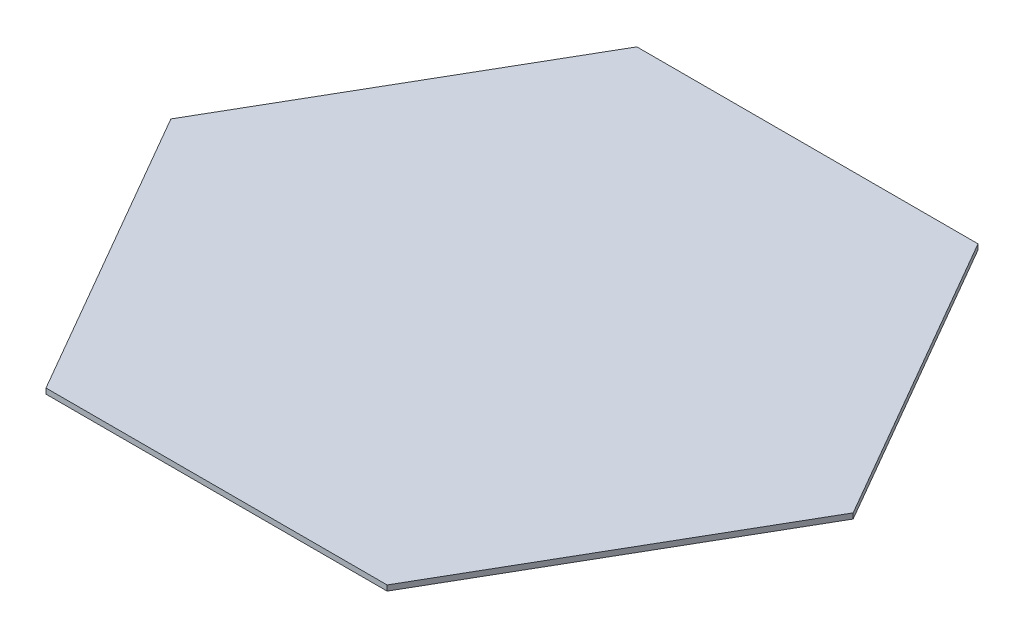
ISO-10303-21;
HEADER;
FILE_DESCRIPTION(('STEP AP214'),'2;1');
FILE_NAME('part.step','',(''),(''),'','','');
FILE_SCHEMA(('AUTOMOTIVE_DESIGN { 1 0 10303 214 1 1 1 1 }'));
ENDSEC;
DATA;
#1=APPLICATION_CONTEXT('core data for automotive mechanical design processes');
#2=APPLICATION_PROTOCOL_DEFINITION('international standard','automotive_design',2000,#1);
#3=PRODUCT_CONTEXT('',#1,'mechanical');
#4=PRODUCT('Part','Part','',(#3));
#5=PRODUCT_RELATED_PRODUCT_CATEGORY('part','',(#4));
#6=PRODUCT_DEFINITION_FORMATION('','',#4);
#7=PRODUCT_DEFINITION_CONTEXT('part definition',#1,'design');
#8=PRODUCT_DEFINITION('design','',#6,#7);
#9=PRODUCT_DEFINITION_SHAPE('','',#8);
#10=(LENGTH_UNIT() NAMED_UNIT(*) SI_UNIT(.MILLI.,.METRE.));
#11=(NAMED_UNIT(*) PLANE_ANGLE_UNIT() SI_UNIT($,.RADIAN.));
#12=(NAMED_UNIT(*) SI_UNIT($,.STERADIAN.) SOLID_ANGLE_UNIT());
#13=UNCERTAINTY_MEASURE_WITH_UNIT(LENGTH_MEASURE(1.E-05),#10,'distance_accuracy_value','');
#14=(GEOMETRIC_REPRESENTATION_CONTEXT(3) GLOBAL_UNCERTAINTY_ASSIGNED_CONTEXT((#13)) GLOBAL_UNIT_ASSIGNED_CONTEXT((#10,
#11,#12)) REPRESENTATION_CONTEXT('',''));
#15=CARTESIAN_POINT('',(0.,0.,0.));
#16=DIRECTION('',(0.,0.,1.));
#17=DIRECTION('',(1.,0.,0.));
#18=AXIS2_PLACEMENT_3D('',#15,#16,#17);
#19=CARTESIAN_POINT('',(-31.7500000000001,1.,-54.9926131403118));
#20=DIRECTION('',(0.866025403784439,0.,0.499999999999999));
#21=DIRECTION('',(0.499999999999999,0.,-0.866025403784439));
#22=AXIS2_PLACEMENT_3D('',#19,#20,#21);
#23=PLANE('',#22);
#24=DIRECTION('',(-0.499999999999999,0.,0.866025403784439));
#25=VECTOR('',#24,1.);
#26=CARTESIAN_POINT('',(-31.7500000000001,0.,-54.9926131403118));
#27=LINE('',#26,#25);
#28=CARTESIAN_POINT('',(-31.7500000000001,0.,-54.9926131403118));
#29=VERTEX_POINT('',#28);
#30=CARTESIAN_POINT('',(-63.5,0.,0.));
#31=VERTEX_POINT('',#30);
#32=EDGE_CURVE('E118',#29,#31,#27,.T.);
#33=ORIENTED_EDGE('',*,*,#32,.T.);
#34=DIRECTION('',(0.,-1.,0.));
#35=VECTOR('',#34,1.);
#36=CARTESIAN_POINT('',(-63.5,1.,0.));
#37=LINE('',#36,#35);
#38=CARTESIAN_POINT('',(-63.5,1.,0.));
#39=VERTEX_POINT('',#38);
#40=EDGE_CURVE('E11',#39,#31,#37,.T.);
#41=ORIENTED_EDGE('',*,*,#40,.F.);
#42=DIRECTION('',(-0.499999999999999,0.,0.866025403784439));
#43=VECTOR('',#42,1.);
#44=CARTESIAN_POINT('',(-31.7500000000001,1.,-54.9926131403118));
#45=LINE('',#44,#43);
#46=CARTESIAN_POINT('',(-31.7500000000001,1.,-54.9926131403118));
#47=VERTEX_POINT('',#46);
#48=EDGE_CURVE('E128',#47,#39,#45,.T.);
#49=ORIENTED_EDGE('',*,*,#48,.F.);
#50=DIRECTION('',(0.,-1.,0.));
#51=VECTOR('',#50,1.);
#52=CARTESIAN_POINT('',(-31.7500000000001,1.,-54.9926131403118));
#53=LINE('',#52,#51);
#54=EDGE_CURVE('E114',#47,#29,#53,.T.);
#55=ORIENTED_EDGE('',*,*,#54,.T.);
#56=EDGE_LOOP('',(#33,#41,#49,#55));
#57=FACE_BOUND('',#56,.T.);
#58=ADVANCED_FACE('F34',(#57),#23,.F.);
#59=CARTESIAN_POINT('',(-63.5,1.,0.));
#60=DIRECTION('',(0.866025403784438,0.,-0.500000000000002));
#61=DIRECTION('',(-0.500000000000002,0.,-0.866025403784438));
#62=AXIS2_PLACEMENT_3D('',#59,#60,#61);
#63=PLANE('',#62);
#64=DIRECTION('',(0.500000000000002,0.,0.866025403784438));
#65=VECTOR('',#64,1.);
#66=CARTESIAN_POINT('',(-63.5,0.,0.));
#67=LINE('',#66,#65);
#68=CARTESIAN_POINT('',(-31.7499999999999,0.,54.9926131403119));
#69=VERTEX_POINT('',#68);
#70=EDGE_CURVE('E121',#31,#69,#67,.T.);
#71=ORIENTED_EDGE('',*,*,#70,.T.);
#72=DIRECTION('',(0.,-1.,0.));
#73=VECTOR('',#72,1.);
#74=CARTESIAN_POINT('',(-31.7499999999999,1.,54.9926131403119));
#75=LINE('',#74,#73);
#76=CARTESIAN_POINT('',(-31.7499999999999,1.,54.9926131403119));
#77=VERTEX_POINT('',#76);
#78=EDGE_CURVE('E42',#77,#69,#75,.T.);
#79=ORIENTED_EDGE('',*,*,#78,.F.);
#80=DIRECTION('',(0.500000000000002,0.,0.866025403784438));
#81=VECTOR('',#80,1.);
#82=CARTESIAN_POINT('',(-63.5,1.,0.));
#83=LINE('',#82,#81);
#84=EDGE_CURVE('E87',#39,#77,#83,.T.);
#85=ORIENTED_EDGE('',*,*,#84,.F.);
#86=ORIENTED_EDGE('',*,*,#40,.T.);
#87=EDGE_LOOP('',(#71,#79,#85,#86));
#88=FACE_BOUND('',#87,.T.);
#89=ADVANCED_FACE('F152',(#88),#63,.F.);
#90=CARTESIAN_POINT('',(-31.7499999999999,1.,54.9926131403119));
#91=DIRECTION('',(0.,0.,-1.));
#92=DIRECTION('',(-1.,0.,0.));
#93=AXIS2_PLACEMENT_3D('',#90,#91,#92);
#94=PLANE('',#93);
#95=DIRECTION('',(1.,0.,0.));
#96=VECTOR('',#95,1.);
#97=CARTESIAN_POINT('',(-31.7499999999999,0.,54.9926131403119));
#98=LINE('',#97,#96);
#99=CARTESIAN_POINT('',(31.7500000000001,0.,54.9926131403118));
#100=VERTEX_POINT('',#99);
#101=EDGE_CURVE('E123',#69,#100,#98,.T.);
#102=ORIENTED_EDGE('',*,*,#101,.T.);
#103=DIRECTION('',(0.,-1.,0.));
#104=VECTOR('',#103,1.);
#105=CARTESIAN_POINT('',(31.7500000000001,1.,54.9926131403118));
#106=LINE('',#105,#104);
#107=CARTESIAN_POINT('',(31.7500000000001,1.,54.9926131403118));
#108=VERTEX_POINT('',#107);
#109=EDGE_CURVE('E109',#108,#100,#106,.T.);
#110=ORIENTED_EDGE('',*,*,#109,.F.);
#111=DIRECTION('',(1.,0.,0.));
#112=VECTOR('',#111,1.);
#113=CARTESIAN_POINT('',(-31.7499999999999,1.,54.9926131403119));
#114=LINE('',#113,#112);
#115=EDGE_CURVE('E100',#77,#108,#114,.T.);
#116=ORIENTED_EDGE('',*,*,#115,.F.);
#117=ORIENTED_EDGE('',*,*,#78,.T.);
#118=EDGE_LOOP('',(#102,#110,#116,#117));
#119=FACE_BOUND('',#118,.T.);
#120=ADVANCED_FACE('F134',(#119),#94,.F.);
#121=CARTESIAN_POINT('',(31.7500000000001,1.,54.9926131403118));
#122=DIRECTION('',(-0.866025403784439,0.,-0.499999999999999));
#123=DIRECTION('',(-0.499999999999999,0.,0.866025403784439));
#124=AXIS2_PLACEMENT_3D('',#121,#122,#123);
#125=PLANE('',#124);
#126=DIRECTION('',(0.499999999999999,0.,-0.866025403784439));
#127=VECTOR('',#126,1.);
#128=CARTESIAN_POINT('',(31.7500000000001,0.,54.9926131403118));
#129=LINE('',#128,#127);
#130=CARTESIAN_POINT('',(63.5,0.,-1.04083408558608E-13));
#131=VERTEX_POINT('',#130);
#132=EDGE_CURVE('E108',#100,#131,#129,.T.);
#133=ORIENTED_EDGE('',*,*,#132,.T.);
#134=DIRECTION('',(0.,-1.,0.));
#135=VECTOR('',#134,1.);
#136=CARTESIAN_POINT('',(63.5,1.,-1.04083408558608E-13));
#137=LINE('',#136,#135);
#138=CARTESIAN_POINT('',(63.5,1.,-1.04083408558608E-13));
#139=VERTEX_POINT('',#138);
#140=EDGE_CURVE('E105',#139,#131,#137,.T.);
#141=ORIENTED_EDGE('',*,*,#140,.F.);
#142=DIRECTION('',(0.499999999999999,0.,-0.866025403784439));
#143=VECTOR('',#142,1.);
#144=CARTESIAN_POINT('',(31.7500000000001,1.,54.9926131403118));
#145=LINE('',#144,#143);
#146=EDGE_CURVE('E94',#108,#139,#145,.T.);
#147=ORIENTED_EDGE('',*,*,#146,.F.);
#148=ORIENTED_EDGE('',*,*,#109,.T.);
#149=EDGE_LOOP('',(#133,#141,#147,#148));
#150=FACE_BOUND('',#149,.T.);
#151=ADVANCED_FACE('F106',(#150),#125,.F.);
#152=CARTESIAN_POINT('',(63.5,1.,-1.04083408558608E-13));
#153=DIRECTION('',(-0.866025403784438,0.,0.500000000000002));
#154=DIRECTION('',(0.500000000000002,0.,0.866025403784438));
#155=AXIS2_PLACEMENT_3D('',#152,#153,#154);
#156=PLANE('',#155);
#157=DIRECTION('',(-0.500000000000002,0.,-0.866025403784438));
#158=VECTOR('',#157,1.);
#159=CARTESIAN_POINT('',(63.5,0.,-1.04083408558608E-13));
#160=LINE('',#159,#158);
#161=CARTESIAN_POINT('',(31.7499999999999,0.,-54.9926131403119));
#162=VERTEX_POINT('',#161);
#163=EDGE_CURVE('E73',#131,#162,#160,.T.);
#164=ORIENTED_EDGE('',*,*,#163,.T.);
#165=DIRECTION('',(0.,-1.,0.));
#166=VECTOR('',#165,1.);
#167=CARTESIAN_POINT('',(31.7499999999999,1.,-54.9926131403119));
#168=LINE('',#167,#166);
#169=CARTESIAN_POINT('',(31.7499999999999,1.,-54.9926131403119));
#170=VERTEX_POINT('',#169);
#171=EDGE_CURVE('E110',#170,#162,#168,.T.);
#172=ORIENTED_EDGE('',*,*,#171,.F.);
#173=DIRECTION('',(-0.500000000000002,0.,-0.866025403784438));
#174=VECTOR('',#173,1.);
#175=CARTESIAN_POINT('',(63.5,1.,-1.04083408558608E-13));
#176=LINE('',#175,#174);
#177=EDGE_CURVE('E98',#139,#170,#176,.T.);
#178=ORIENTED_EDGE('',*,*,#177,.F.);
#179=ORIENTED_EDGE('',*,*,#140,.T.);
#180=EDGE_LOOP('',(#164,#172,#178,#179));
#181=FACE_BOUND('',#180,.T.);
#182=ADVANCED_FACE('F112',(#181),#156,.F.);
#183=CARTESIAN_POINT('',(31.7499999999999,1.,-54.9926131403119));
#184=DIRECTION('',(0.,0.,1.));
#185=DIRECTION('',(1.,0.,0.));
#186=AXIS2_PLACEMENT_3D('',#183,#184,#185);
#187=PLANE('',#186);
#188=DIRECTION('',(-1.,0.,0.));
#189=VECTOR('',#188,1.);
#190=CARTESIAN_POINT('',(31.7499999999999,0.,-54.9926131403119));
#191=LINE('',#190,#189);
#192=EDGE_CURVE('E79',#162,#29,#191,.T.);
#193=ORIENTED_EDGE('',*,*,#192,.T.);
#194=ORIENTED_EDGE('',*,*,#54,.F.);
#195=DIRECTION('',(-1.,0.,0.));
#196=VECTOR('',#195,1.);
#197=CARTESIAN_POINT('',(31.7499999999999,1.,-54.9926131403119));
#198=LINE('',#197,#196);
#199=EDGE_CURVE('E50',#170,#47,#198,.T.);
#200=ORIENTED_EDGE('',*,*,#199,.F.);
#201=ORIENTED_EDGE('',*,*,#171,.T.);
#202=EDGE_LOOP('',(#193,#194,#200,#201));
#203=FACE_BOUND('',#202,.T.);
#204=ADVANCED_FACE('F141',(#203),#187,.F.);
#205=CARTESIAN_POINT('',(0.,1.,0.));
#206=DIRECTION('',(0.,1.,0.));
#207=DIRECTION('',(0.,0.,1.));
#208=AXIS2_PLACEMENT_3D('',#205,#206,#207);
#209=PLANE('',#208);
#210=ORIENTED_EDGE('',*,*,#48,.T.);
#211=ORIENTED_EDGE('',*,*,#84,.T.);
#212=ORIENTED_EDGE('',*,*,#115,.T.);
#213=ORIENTED_EDGE('',*,*,#146,.T.);
#214=ORIENTED_EDGE('',*,*,#177,.T.);
#215=ORIENTED_EDGE('',*,*,#199,.T.);
#216=EDGE_LOOP('',(#210,#211,#212,#213,#214,#215));
#217=FACE_BOUND('',#216,.T.);
#218=ADVANCED_FACE('F96',(#217),#209,.T.);
#219=CARTESIAN_POINT('',(0.,0.,0.));
#220=DIRECTION('',(0.,1.,0.));
#221=DIRECTION('',(0.,0.,1.));
#222=AXIS2_PLACEMENT_3D('',#219,#220,#221);
#223=PLANE('',#222);
#224=ORIENTED_EDGE('',*,*,#32,.F.);
#225=ORIENTED_EDGE('',*,*,#192,.F.);
#226=ORIENTED_EDGE('',*,*,#163,.F.);
#227=ORIENTED_EDGE('',*,*,#132,.F.);
#228=ORIENTED_EDGE('',*,*,#101,.F.);
#229=ORIENTED_EDGE('',*,*,#70,.F.);
#230=EDGE_LOOP('',(#224,#225,#226,#227,#228,#229));
#231=FACE_BOUND('',#230,.T.);
#232=ADVANCED_FACE('F137',(#231),#223,.F.);
#233=CLOSED_SHELL('',(#58,#89,#120,#151,#182,#204,#218,#232));
#234=MANIFOLD_SOLID_BREP('B2',#233);
#235=ADVANCED_BREP_SHAPE_REPRESENTATION('',(#18,#234),#14);
#236=SHAPE_DEFINITION_REPRESENTATION(#9,#235);
ENDSEC;
END-ISO-10303-21;
